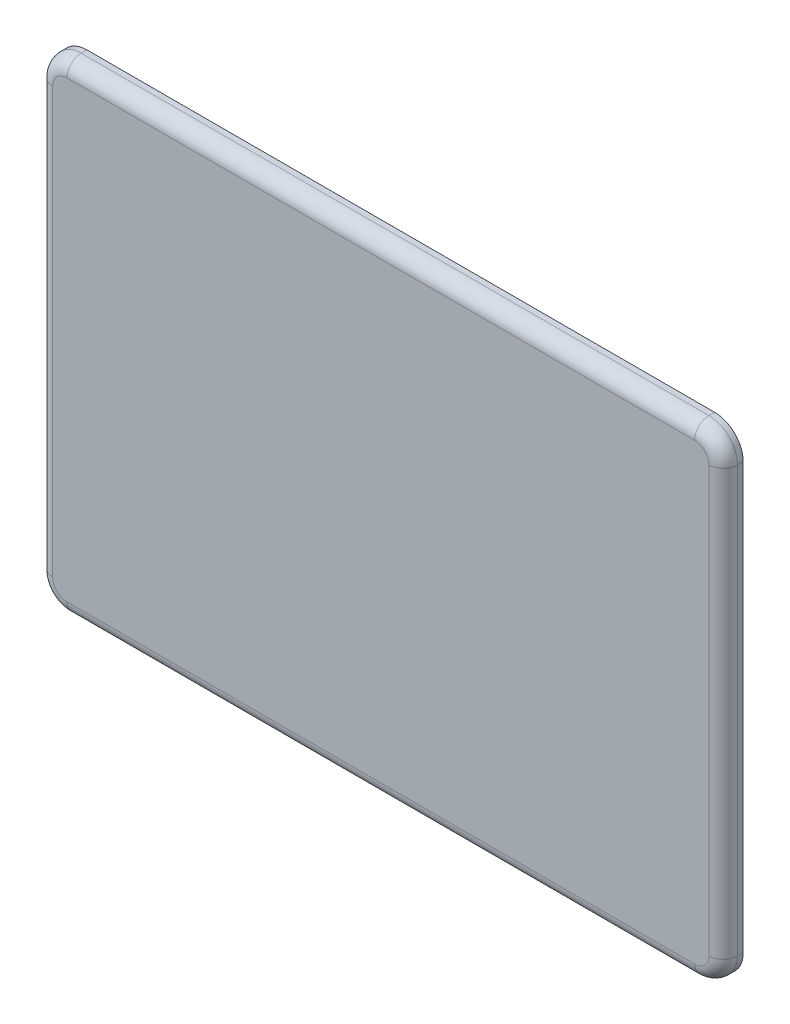
ISO-10303-21;
HEADER;
FILE_DESCRIPTION(('STEP AP214'),'2;1');
FILE_NAME('part.step','',(''),(''),'','','');
FILE_SCHEMA(('AUTOMOTIVE_DESIGN { 1 0 10303 214 1 1 1 1 }'));
ENDSEC;
DATA;
#1=APPLICATION_CONTEXT('core data for automotive mechanical design processes');
#2=APPLICATION_PROTOCOL_DEFINITION('international standard','automotive_design',2000,#1);
#3=PRODUCT_CONTEXT('',#1,'mechanical');
#4=PRODUCT('Part','Part','',(#3));
#5=PRODUCT_RELATED_PRODUCT_CATEGORY('part','',(#4));
#6=PRODUCT_DEFINITION_FORMATION('','',#4);
#7=PRODUCT_DEFINITION_CONTEXT('part definition',#1,'design');
#8=PRODUCT_DEFINITION('design','',#6,#7);
#9=PRODUCT_DEFINITION_SHAPE('','',#8);
#10=(LENGTH_UNIT() NAMED_UNIT(*) SI_UNIT(.MILLI.,.METRE.));
#11=(NAMED_UNIT(*) PLANE_ANGLE_UNIT() SI_UNIT($,.RADIAN.));
#12=(NAMED_UNIT(*) SI_UNIT($,.STERADIAN.) SOLID_ANGLE_UNIT());
#13=UNCERTAINTY_MEASURE_WITH_UNIT(LENGTH_MEASURE(1.E-05),#10,'distance_accuracy_value','');
#14=(GEOMETRIC_REPRESENTATION_CONTEXT(3) GLOBAL_UNCERTAINTY_ASSIGNED_CONTEXT((#13)) GLOBAL_UNIT_ASSIGNED_CONTEXT((#10,
#11,#12)) REPRESENTATION_CONTEXT('',''));
#15=CARTESIAN_POINT('',(0.,0.,0.));
#16=DIRECTION('',(0.,0.,1.));
#17=DIRECTION('',(1.,0.,0.));
#18=AXIS2_PLACEMENT_3D('',#15,#16,#17);
#19=CARTESIAN_POINT('',(-176.117936117936,75.0737100737101,7.));
#20=DIRECTION('',(0.,0.,-1.));
#21=DIRECTION('',(-1.,0.,0.));
#22=AXIS2_PLACEMENT_3D('',#19,#20,#21);
#23=CYLINDRICAL_SURFACE('',#22,10.);
#24=DIRECTION('',(0.,0.,-1.));
#25=VECTOR('',#24,1.);
#26=CARTESIAN_POINT('',(-186.117936117936,75.07371007371,7.));
#27=LINE('',#26,#25);
#28=CARTESIAN_POINT('',(-186.117936117936,75.07371007371,2.));
#29=VERTEX_POINT('',#28);
#30=CARTESIAN_POINT('',(-186.117936117936,75.07371007371,0.));
#31=VERTEX_POINT('',#30);
#32=EDGE_CURVE('E263',#29,#31,#27,.T.);
#33=ORIENTED_EDGE('',*,*,#32,.F.);
#34=CARTESIAN_POINT('',(-176.117936117936,75.0737100737101,2.));
#35=DIRECTION('',(0.,0.,1.));
#36=DIRECTION('',(1.,0.,0.));
#37=AXIS2_PLACEMENT_3D('',#34,#35,#36);
#38=CIRCLE('',#37,10.);
#39=CARTESIAN_POINT('',(-176.117936117936,85.07371007371,2.));
#40=VERTEX_POINT('',#39);
#41=EDGE_CURVE('E291',#29,#40,#38,.F.);
#42=ORIENTED_EDGE('',*,*,#41,.T.);
#43=DIRECTION('',(0.,0.,-1.));
#44=VECTOR('',#43,1.);
#45=CARTESIAN_POINT('',(-176.117936117936,85.07371007371,7.));
#46=LINE('',#45,#44);
#47=CARTESIAN_POINT('',(-176.117936117936,85.07371007371,0.));
#48=VERTEX_POINT('',#47);
#49=EDGE_CURVE('E242',#40,#48,#46,.T.);
#50=ORIENTED_EDGE('',*,*,#49,.T.);
#51=CARTESIAN_POINT('',(-176.117936117936,75.0737100737101,0.));
#52=DIRECTION('',(0.,0.,1.));
#53=DIRECTION('',(1.,0.,0.));
#54=AXIS2_PLACEMENT_3D('',#51,#52,#53);
#55=CIRCLE('',#54,10.);
#56=EDGE_CURVE('E210',#48,#31,#55,.T.);
#57=ORIENTED_EDGE('',*,*,#56,.T.);
#58=EDGE_LOOP('',(#33,#42,#50,#57));
#59=FACE_BOUND('',#58,.T.);
#60=ADVANCED_FACE('F40',(#59),#23,.T.);
#61=CARTESIAN_POINT('',(-186.117936117936,75.07371007371,7.));
#62=DIRECTION('',(1.,0.,0.));
#63=DIRECTION('',(0.,0.,-1.));
#64=AXIS2_PLACEMENT_3D('',#61,#62,#63);
#65=PLANE('',#64);
#66=DIRECTION('',(0.,0.,-1.));
#67=VECTOR('',#66,1.);
#68=CARTESIAN_POINT('',(-186.117936117936,-73.9262899262899,7.));
#69=LINE('',#68,#67);
#70=CARTESIAN_POINT('',(-186.117936117936,-73.9262899262899,2.));
#71=VERTEX_POINT('',#70);
#72=CARTESIAN_POINT('',(-186.117936117936,-73.9262899262899,0.));
#73=VERTEX_POINT('',#72);
#74=EDGE_CURVE('E260',#71,#73,#69,.T.);
#75=ORIENTED_EDGE('',*,*,#74,.F.);
#76=DIRECTION('',(0.,-1.,0.));
#77=VECTOR('',#76,1.);
#78=CARTESIAN_POINT('',(-186.117936117936,75.07371007371,2.));
#79=LINE('',#78,#77);
#80=EDGE_CURVE('E11',#71,#29,#79,.F.);
#81=ORIENTED_EDGE('',*,*,#80,.T.);
#82=ORIENTED_EDGE('',*,*,#32,.T.);
#83=DIRECTION('',(0.,-1.,0.));
#84=VECTOR('',#83,1.);
#85=CARTESIAN_POINT('',(-186.117936117936,75.07371007371,0.));
#86=LINE('',#85,#84);
#87=EDGE_CURVE('E214',#31,#73,#86,.T.);
#88=ORIENTED_EDGE('',*,*,#87,.T.);
#89=EDGE_LOOP('',(#75,#81,#82,#88));
#90=FACE_BOUND('',#89,.T.);
#91=ADVANCED_FACE('F393',(#90),#65,.F.);
#92=CARTESIAN_POINT('',(-176.117936117936,-73.92628992629,7.));
#93=DIRECTION('',(0.,0.,-1.));
#94=DIRECTION('',(-1.,0.,0.));
#95=AXIS2_PLACEMENT_3D('',#92,#93,#94);
#96=CYLINDRICAL_SURFACE('',#95,10.);
#97=DIRECTION('',(0.,0.,-1.));
#98=VECTOR('',#97,1.);
#99=CARTESIAN_POINT('',(-176.117936117936,-83.92628992629,7.));
#100=LINE('',#99,#98);
#101=CARTESIAN_POINT('',(-176.117936117936,-83.92628992629,2.));
#102=VERTEX_POINT('',#101);
#103=CARTESIAN_POINT('',(-176.117936117936,-83.92628992629,0.));
#104=VERTEX_POINT('',#103);
#105=EDGE_CURVE('E257',#102,#104,#100,.T.);
#106=ORIENTED_EDGE('',*,*,#105,.F.);
#107=CARTESIAN_POINT('',(-176.117936117936,-73.92628992629,2.));
#108=DIRECTION('',(0.,0.,1.));
#109=DIRECTION('',(1.,0.,0.));
#110=AXIS2_PLACEMENT_3D('',#107,#108,#109);
#111=CIRCLE('',#110,10.);
#112=EDGE_CURVE('E50',#102,#71,#111,.F.);
#113=ORIENTED_EDGE('',*,*,#112,.T.);
#114=ORIENTED_EDGE('',*,*,#74,.T.);
#115=CARTESIAN_POINT('',(-176.117936117936,-73.92628992629,0.));
#116=DIRECTION('',(0.,0.,1.));
#117=DIRECTION('',(1.,0.,0.));
#118=AXIS2_PLACEMENT_3D('',#115,#116,#117);
#119=CIRCLE('',#118,10.);
#120=EDGE_CURVE('E218',#73,#104,#119,.T.);
#121=ORIENTED_EDGE('',*,*,#120,.T.);
#122=EDGE_LOOP('',(#106,#113,#114,#121));
#123=FACE_BOUND('',#122,.T.);
#124=ADVANCED_FACE('F412',(#123),#96,.T.);
#125=CARTESIAN_POINT('',(-176.117936117936,-83.92628992629,7.));
#126=DIRECTION('',(0.,1.,0.));
#127=DIRECTION('',(0.,0.,1.));
#128=AXIS2_PLACEMENT_3D('',#125,#126,#127);
#129=PLANE('',#128);
#130=DIRECTION('',(0.,0.,-1.));
#131=VECTOR('',#130,1.);
#132=CARTESIAN_POINT('',(43.8820638820638,-83.92628992629,7.));
#133=LINE('',#132,#131);
#134=CARTESIAN_POINT('',(43.8820638820638,-83.92628992629,2.));
#135=VERTEX_POINT('',#134);
#136=CARTESIAN_POINT('',(43.8820638820638,-83.92628992629,0.));
#137=VERTEX_POINT('',#136);
#138=EDGE_CURVE('E254',#135,#137,#133,.T.);
#139=ORIENTED_EDGE('',*,*,#138,.F.);
#140=DIRECTION('',(1.,0.,0.));
#141=VECTOR('',#140,1.);
#142=CARTESIAN_POINT('',(-176.117936117936,-83.92628992629,2.));
#143=LINE('',#142,#141);
#144=EDGE_CURVE('E65',#135,#102,#143,.F.);
#145=ORIENTED_EDGE('',*,*,#144,.T.);
#146=ORIENTED_EDGE('',*,*,#105,.T.);
#147=DIRECTION('',(1.,0.,0.));
#148=VECTOR('',#147,1.);
#149=CARTESIAN_POINT('',(-176.117936117936,-83.92628992629,0.));
#150=LINE('',#149,#148);
#151=EDGE_CURVE('E222',#104,#137,#150,.T.);
#152=ORIENTED_EDGE('',*,*,#151,.T.);
#153=EDGE_LOOP('',(#139,#145,#146,#152));
#154=FACE_BOUND('',#153,.T.);
#155=ADVANCED_FACE('F351',(#154),#129,.F.);
#156=CARTESIAN_POINT('',(43.8820638820639,-73.92628992629,7.));
#157=DIRECTION('',(0.,0.,-1.));
#158=DIRECTION('',(-1.,0.,0.));
#159=AXIS2_PLACEMENT_3D('',#156,#157,#158);
#160=CYLINDRICAL_SURFACE('',#159,10.);
#161=DIRECTION('',(0.,0.,-1.));
#162=VECTOR('',#161,1.);
#163=CARTESIAN_POINT('',(53.8820638820639,-73.9262899262899,7.));
#164=LINE('',#163,#162);
#165=CARTESIAN_POINT('',(53.8820638820639,-73.9262899262899,2.));
#166=VERTEX_POINT('',#165);
#167=CARTESIAN_POINT('',(53.8820638820639,-73.9262899262899,0.));
#168=VERTEX_POINT('',#167);
#169=EDGE_CURVE('E251',#166,#168,#164,.T.);
#170=ORIENTED_EDGE('',*,*,#169,.F.);
#171=CARTESIAN_POINT('',(43.8820638820639,-73.92628992629,2.));
#172=DIRECTION('',(0.,0.,1.));
#173=DIRECTION('',(1.,0.,0.));
#174=AXIS2_PLACEMENT_3D('',#171,#172,#173);
#175=CIRCLE('',#174,10.);
#176=EDGE_CURVE('E304',#166,#135,#175,.F.);
#177=ORIENTED_EDGE('',*,*,#176,.T.);
#178=ORIENTED_EDGE('',*,*,#138,.T.);
#179=CARTESIAN_POINT('',(43.8820638820639,-73.92628992629,0.));
#180=DIRECTION('',(0.,0.,1.));
#181=DIRECTION('',(1.,0.,0.));
#182=AXIS2_PLACEMENT_3D('',#179,#180,#181);
#183=CIRCLE('',#182,10.);
#184=EDGE_CURVE('E226',#137,#168,#183,.T.);
#185=ORIENTED_EDGE('',*,*,#184,.T.);
#186=EDGE_LOOP('',(#170,#177,#178,#185));
#187=FACE_BOUND('',#186,.T.);
#188=ADVANCED_FACE('F350',(#187),#160,.T.);
#189=CARTESIAN_POINT('',(53.8820638820639,75.07371007371,7.));
#190=DIRECTION('',(-1.,0.,0.));
#191=DIRECTION('',(0.,-1.,0.));
#192=AXIS2_PLACEMENT_3D('',#189,#190,#191);
#193=PLANE('',#192);
#194=DIRECTION('',(0.,0.,-1.));
#195=VECTOR('',#194,1.);
#196=CARTESIAN_POINT('',(53.8820638820639,75.07371007371,7.));
#197=LINE('',#196,#195);
#198=CARTESIAN_POINT('',(53.8820638820639,75.07371007371,2.));
#199=VERTEX_POINT('',#198);
#200=CARTESIAN_POINT('',(53.8820638820639,75.07371007371,0.));
#201=VERTEX_POINT('',#200);
#202=EDGE_CURVE('E248',#199,#201,#197,.T.);
#203=ORIENTED_EDGE('',*,*,#202,.F.);
#204=DIRECTION('',(0.,1.,0.));
#205=VECTOR('',#204,1.);
#206=CARTESIAN_POINT('',(53.8820638820639,-73.9262899262899,2.));
#207=LINE('',#206,#205);
#208=EDGE_CURVE('E301',#199,#166,#207,.F.);
#209=ORIENTED_EDGE('',*,*,#208,.T.);
#210=ORIENTED_EDGE('',*,*,#169,.T.);
#211=DIRECTION('',(0.,1.,0.));
#212=VECTOR('',#211,1.);
#213=CARTESIAN_POINT('',(53.8820638820639,75.07371007371,0.));
#214=LINE('',#213,#212);
#215=EDGE_CURVE('E230',#168,#201,#214,.T.);
#216=ORIENTED_EDGE('',*,*,#215,.T.);
#217=EDGE_LOOP('',(#203,#209,#210,#216));
#218=FACE_BOUND('',#217,.T.);
#219=ADVANCED_FACE('F363',(#218),#193,.F.);
#220=CARTESIAN_POINT('',(43.8820638820639,75.0737100737101,7.));
#221=DIRECTION('',(0.,0.,-1.));
#222=DIRECTION('',(-1.,0.,0.));
#223=AXIS2_PLACEMENT_3D('',#220,#221,#222);
#224=CYLINDRICAL_SURFACE('',#223,9.99999999999999);
#225=DIRECTION('',(0.,0.,-1.));
#226=VECTOR('',#225,1.);
#227=CARTESIAN_POINT('',(43.8820638820638,85.07371007371,7.));
#228=LINE('',#227,#226);
#229=CARTESIAN_POINT('',(43.8820638820638,85.07371007371,2.));
#230=VERTEX_POINT('',#229);
#231=CARTESIAN_POINT('',(43.8820638820638,85.07371007371,0.));
#232=VERTEX_POINT('',#231);
#233=EDGE_CURVE('E245',#230,#232,#228,.T.);
#234=ORIENTED_EDGE('',*,*,#233,.F.);
#235=CARTESIAN_POINT('',(43.8820638820639,75.0737100737101,2.));
#236=DIRECTION('',(0.,0.,1.));
#237=DIRECTION('',(1.,0.,0.));
#238=AXIS2_PLACEMENT_3D('',#235,#236,#237);
#239=CIRCLE('',#238,9.99999999999999);
#240=EDGE_CURVE('E298',#230,#199,#239,.F.);
#241=ORIENTED_EDGE('',*,*,#240,.T.);
#242=ORIENTED_EDGE('',*,*,#202,.T.);
#243=CARTESIAN_POINT('',(43.8820638820639,75.0737100737101,0.));
#244=DIRECTION('',(0.,0.,1.));
#245=DIRECTION('',(-1.,0.,0.));
#246=AXIS2_PLACEMENT_3D('',#243,#244,#245);
#247=CIRCLE('',#246,9.99999999999999);
#248=EDGE_CURVE('E234',#201,#232,#247,.T.);
#249=ORIENTED_EDGE('',*,*,#248,.T.);
#250=EDGE_LOOP('',(#234,#241,#242,#249));
#251=FACE_BOUND('',#250,.T.);
#252=ADVANCED_FACE('F366',(#251),#224,.T.);
#253=CARTESIAN_POINT('',(-176.117936117936,85.07371007371,7.));
#254=DIRECTION('',(0.,-1.,0.));
#255=DIRECTION('',(0.,0.,-1.));
#256=AXIS2_PLACEMENT_3D('',#253,#254,#255);
#257=PLANE('',#256);
#258=ORIENTED_EDGE('',*,*,#49,.F.);
#259=DIRECTION('',(-1.,0.,0.));
#260=VECTOR('',#259,1.);
#261=CARTESIAN_POINT('',(43.8820638820638,85.07371007371,2.));
#262=LINE('',#261,#260);
#263=EDGE_CURVE('E295',#40,#230,#262,.F.);
#264=ORIENTED_EDGE('',*,*,#263,.T.);
#265=ORIENTED_EDGE('',*,*,#233,.T.);
#266=DIRECTION('',(-1.,0.,0.));
#267=VECTOR('',#266,1.);
#268=CARTESIAN_POINT('',(-176.117936117936,85.07371007371,0.));
#269=LINE('',#268,#267);
#270=EDGE_CURVE('E238',#232,#48,#269,.T.);
#271=ORIENTED_EDGE('',*,*,#270,.T.);
#272=EDGE_LOOP('',(#258,#264,#265,#271));
#273=FACE_BOUND('',#272,.T.);
#274=ADVANCED_FACE('F425',(#273),#257,.F.);
#275=CARTESIAN_POINT('',(-176.117936117936,75.0737100737101,7.));
#276=DIRECTION('',(0.,0.,1.));
#277=DIRECTION('',(1.,0.,0.));
#278=AXIS2_PLACEMENT_3D('',#275,#276,#277);
#279=PLANE('',#278);
#280=DIRECTION('',(-1.,0.,0.));
#281=VECTOR('',#280,1.);
#282=CARTESIAN_POINT('',(-176.117936117936,80.07371007371,7.));
#283=LINE('',#282,#281);
#284=CARTESIAN_POINT('',(43.8820638820638,80.07371007371,7.));
#285=VERTEX_POINT('',#284);
#286=CARTESIAN_POINT('',(-176.117936117936,80.07371007371,7.));
#287=VERTEX_POINT('',#286);
#288=EDGE_CURVE('E284',#285,#287,#283,.T.);
#289=ORIENTED_EDGE('',*,*,#288,.T.);
#290=CARTESIAN_POINT('',(-176.117936117936,75.0737100737101,7.));
#291=DIRECTION('',(0.,0.,1.));
#292=DIRECTION('',(1.,0.,0.));
#293=AXIS2_PLACEMENT_3D('',#290,#291,#292);
#294=CIRCLE('',#293,5.);
#295=CARTESIAN_POINT('',(-181.117936117936,75.07371007371,7.));
#296=VERTEX_POINT('',#295);
#297=EDGE_CURVE('E287',#287,#296,#294,.T.);
#298=ORIENTED_EDGE('',*,*,#297,.T.);
#299=DIRECTION('',(0.,-1.,0.));
#300=VECTOR('',#299,1.);
#301=CARTESIAN_POINT('',(-181.117936117936,-73.9262899262899,7.));
#302=LINE('',#301,#300);
#303=CARTESIAN_POINT('',(-181.117936117936,-73.9262899262899,7.));
#304=VERTEX_POINT('',#303);
#305=EDGE_CURVE('E266',#296,#304,#302,.T.);
#306=ORIENTED_EDGE('',*,*,#305,.T.);
#307=CARTESIAN_POINT('',(-176.117936117936,-73.92628992629,7.));
#308=DIRECTION('',(0.,0.,1.));
#309=DIRECTION('',(1.,0.,0.));
#310=AXIS2_PLACEMENT_3D('',#307,#308,#309);
#311=CIRCLE('',#310,5.);
#312=CARTESIAN_POINT('',(-176.117936117936,-78.92628992629,7.));
#313=VERTEX_POINT('',#312);
#314=EDGE_CURVE('E269',#304,#313,#311,.T.);
#315=ORIENTED_EDGE('',*,*,#314,.T.);
#316=DIRECTION('',(1.,0.,0.));
#317=VECTOR('',#316,1.);
#318=CARTESIAN_POINT('',(43.8820638820638,-78.92628992629,7.));
#319=LINE('',#318,#317);
#320=CARTESIAN_POINT('',(43.8820638820639,-78.92628992629,7.));
#321=VERTEX_POINT('',#320);
#322=EDGE_CURVE('E272',#313,#321,#319,.T.);
#323=ORIENTED_EDGE('',*,*,#322,.T.);
#324=CARTESIAN_POINT('',(43.8820638820639,-73.92628992629,7.));
#325=DIRECTION('',(0.,0.,1.));
#326=DIRECTION('',(1.,0.,0.));
#327=AXIS2_PLACEMENT_3D('',#324,#325,#326);
#328=CIRCLE('',#327,5.);
#329=CARTESIAN_POINT('',(48.8820638820639,-73.9262899262899,7.));
#330=VERTEX_POINT('',#329);
#331=EDGE_CURVE('E275',#321,#330,#328,.T.);
#332=ORIENTED_EDGE('',*,*,#331,.T.);
#333=DIRECTION('',(0.,1.,0.));
#334=VECTOR('',#333,1.);
#335=CARTESIAN_POINT('',(48.8820638820639,75.07371007371,7.));
#336=LINE('',#335,#334);
#337=CARTESIAN_POINT('',(48.8820638820639,75.07371007371,7.));
#338=VERTEX_POINT('',#337);
#339=EDGE_CURVE('E278',#330,#338,#336,.T.);
#340=ORIENTED_EDGE('',*,*,#339,.T.);
#341=CARTESIAN_POINT('',(43.8820638820639,75.0737100737101,7.));
#342=DIRECTION('',(0.,0.,1.));
#343=DIRECTION('',(1.,0.,0.));
#344=AXIS2_PLACEMENT_3D('',#341,#342,#343);
#345=CIRCLE('',#344,4.99999999999999);
#346=EDGE_CURVE('E281',#338,#285,#345,.T.);
#347=ORIENTED_EDGE('',*,*,#346,.T.);
#348=EDGE_LOOP('',(#289,#298,#306,#315,#323,#332,#340,#347));
#349=FACE_BOUND('',#348,.T.);
#350=ADVANCED_FACE('F379',(#349),#279,.T.);
#351=CARTESIAN_POINT('',(-176.117936117936,75.0737100737101,0.));
#352=DIRECTION('',(0.,0.,1.));
#353=DIRECTION('',(1.,0.,0.));
#354=AXIS2_PLACEMENT_3D('',#351,#352,#353);
#355=PLANE('',#354);
#356=ORIENTED_EDGE('',*,*,#56,.F.);
#357=ORIENTED_EDGE('',*,*,#270,.F.);
#358=ORIENTED_EDGE('',*,*,#248,.F.);
#359=ORIENTED_EDGE('',*,*,#215,.F.);
#360=ORIENTED_EDGE('',*,*,#184,.F.);
#361=ORIENTED_EDGE('',*,*,#151,.F.);
#362=ORIENTED_EDGE('',*,*,#120,.F.);
#363=ORIENTED_EDGE('',*,*,#87,.F.);
#364=EDGE_LOOP('',(#356,#357,#358,#359,#360,#361,#362,#363));
#365=FACE_BOUND('',#364,.T.);
#366=ADVANCED_FACE('F358',(#365),#355,.F.);
#367=CARTESIAN_POINT('',(43.8820638820639,-73.92628992629,2.));
#368=DIRECTION('',(0.,0.,1.));
#369=DIRECTION('',(1.,0.,0.));
#370=AXIS2_PLACEMENT_3D('',#367,#368,#369);
#371=DEGENERATE_TOROIDAL_SURFACE('',#370,5.,5.,.T.);
#372=CARTESIAN_POINT('',(43.8820638820639,-78.92628992629,2.));
#373=DIRECTION('',(-1.,0.,0.));
#374=DIRECTION('',(0.,-1.,0.));
#375=AXIS2_PLACEMENT_3D('',#372,#373,#374);
#376=CIRCLE('',#375,5.);
#377=EDGE_CURVE('E331',#135,#321,#376,.T.);
#378=ORIENTED_EDGE('',*,*,#377,.F.);
#379=ORIENTED_EDGE('',*,*,#176,.F.);
#380=CARTESIAN_POINT('',(48.8820638820639,-73.9262899262899,2.));
#381=DIRECTION('',(0.,1.,0.));
#382=DIRECTION('',(0.,0.,1.));
#383=AXIS2_PLACEMENT_3D('',#380,#381,#382);
#384=CIRCLE('',#383,5.);
#385=EDGE_CURVE('E44',#330,#166,#384,.T.);
#386=ORIENTED_EDGE('',*,*,#385,.F.);
#387=ORIENTED_EDGE('',*,*,#331,.F.);
#388=EDGE_LOOP('',(#378,#379,#386,#387));
#389=FACE_BOUND('',#388,.T.);
#390=ADVANCED_FACE('F42',(#389),#371,.T.);
#391=CARTESIAN_POINT('',(48.8820638820639,75.0737100737101,2.));
#392=DIRECTION('',(0.,-1.,0.));
#393=DIRECTION('',(1.,0.,0.));
#394=AXIS2_PLACEMENT_3D('',#391,#392,#393);
#395=CYLINDRICAL_SURFACE('',#394,5.);
#396=ORIENTED_EDGE('',*,*,#385,.T.);
#397=ORIENTED_EDGE('',*,*,#208,.F.);
#398=CARTESIAN_POINT('',(48.8820638820639,75.07371007371,2.));
#399=DIRECTION('',(0.,1.,0.));
#400=DIRECTION('',(-1.,0.,0.));
#401=AXIS2_PLACEMENT_3D('',#398,#399,#400);
#402=CIRCLE('',#401,5.);
#403=EDGE_CURVE('E328',#338,#199,#402,.T.);
#404=ORIENTED_EDGE('',*,*,#403,.F.);
#405=ORIENTED_EDGE('',*,*,#339,.F.);
#406=EDGE_LOOP('',(#396,#397,#404,#405));
#407=FACE_BOUND('',#406,.T.);
#408=ADVANCED_FACE('F343',(#407),#395,.T.);
#409=CARTESIAN_POINT('',(-176.117936117936,-78.92628992629,2.));
#410=DIRECTION('',(-1.,0.,0.));
#411=DIRECTION('',(0.,0.,1.));
#412=AXIS2_PLACEMENT_3D('',#409,#410,#411);
#413=CYLINDRICAL_SURFACE('',#412,5.);
#414=ORIENTED_EDGE('',*,*,#377,.T.);
#415=ORIENTED_EDGE('',*,*,#322,.F.);
#416=CARTESIAN_POINT('',(-176.117936117936,-78.92628992629,2.));
#417=DIRECTION('',(-1.,0.,0.));
#418=DIRECTION('',(0.,0.,1.));
#419=AXIS2_PLACEMENT_3D('',#416,#417,#418);
#420=CIRCLE('',#419,5.);
#421=EDGE_CURVE('E324',#102,#313,#420,.T.);
#422=ORIENTED_EDGE('',*,*,#421,.F.);
#423=ORIENTED_EDGE('',*,*,#144,.F.);
#424=EDGE_LOOP('',(#414,#415,#422,#423));
#425=FACE_BOUND('',#424,.T.);
#426=ADVANCED_FACE('F382',(#425),#413,.T.);
#427=CARTESIAN_POINT('',(43.8820638820639,75.0737100737101,2.));
#428=DIRECTION('',(0.,0.,1.));
#429=DIRECTION('',(1.,0.,0.));
#430=AXIS2_PLACEMENT_3D('',#427,#428,#429);
#431=DEGENERATE_TOROIDAL_SURFACE('',#430,4.99999999999999,5.,.T.);
#432=ORIENTED_EDGE('',*,*,#403,.T.);
#433=ORIENTED_EDGE('',*,*,#240,.F.);
#434=CARTESIAN_POINT('',(43.8820638820638,80.07371007371,2.));
#435=DIRECTION('',(-1.,0.,0.));
#436=DIRECTION('',(0.,0.,1.));
#437=AXIS2_PLACEMENT_3D('',#434,#435,#436);
#438=CIRCLE('',#437,5.);
#439=EDGE_CURVE('E320',#285,#230,#438,.T.);
#440=ORIENTED_EDGE('',*,*,#439,.F.);
#441=ORIENTED_EDGE('',*,*,#346,.F.);
#442=EDGE_LOOP('',(#432,#433,#440,#441));
#443=FACE_BOUND('',#442,.T.);
#444=ADVANCED_FACE('F370',(#443),#431,.T.);
#445=CARTESIAN_POINT('',(-176.117936117936,-73.92628992629,2.));
#446=DIRECTION('',(0.,0.,1.));
#447=DIRECTION('',(1.,0.,0.));
#448=AXIS2_PLACEMENT_3D('',#445,#446,#447);
#449=TOROIDAL_SURFACE('',#448,5.,5.);
#450=ORIENTED_EDGE('',*,*,#421,.T.);
#451=ORIENTED_EDGE('',*,*,#314,.F.);
#452=CARTESIAN_POINT('',(-181.117936117936,-73.9262899262899,2.));
#453=DIRECTION('',(0.,1.,0.));
#454=DIRECTION('',(-1.,0.,0.));
#455=AXIS2_PLACEMENT_3D('',#452,#453,#454);
#456=CIRCLE('',#455,5.);
#457=EDGE_CURVE('E316',#71,#304,#456,.T.);
#458=ORIENTED_EDGE('',*,*,#457,.F.);
#459=ORIENTED_EDGE('',*,*,#112,.F.);
#460=EDGE_LOOP('',(#450,#451,#458,#459));
#461=FACE_BOUND('',#460,.T.);
#462=ADVANCED_FACE('F384',(#461),#449,.T.);
#463=CARTESIAN_POINT('',(-176.117936117936,80.07371007371,2.));
#464=DIRECTION('',(1.,0.,0.));
#465=DIRECTION('',(0.,0.,-1.));
#466=AXIS2_PLACEMENT_3D('',#463,#464,#465);
#467=CYLINDRICAL_SURFACE('',#466,5.);
#468=ORIENTED_EDGE('',*,*,#439,.T.);
#469=ORIENTED_EDGE('',*,*,#263,.F.);
#470=CARTESIAN_POINT('',(-176.117936117936,80.07371007371,2.));
#471=DIRECTION('',(-1.,0.,0.));
#472=DIRECTION('',(0.,-1.,0.));
#473=AXIS2_PLACEMENT_3D('',#470,#471,#472);
#474=CIRCLE('',#473,5.);
#475=EDGE_CURVE('E313',#287,#40,#474,.T.);
#476=ORIENTED_EDGE('',*,*,#475,.F.);
#477=ORIENTED_EDGE('',*,*,#288,.F.);
#478=EDGE_LOOP('',(#468,#469,#476,#477));
#479=FACE_BOUND('',#478,.T.);
#480=ADVANCED_FACE('F375',(#479),#467,.T.);
#481=CARTESIAN_POINT('',(-181.117936117936,75.0737100737101,2.));
#482=DIRECTION('',(0.,1.,0.));
#483=DIRECTION('',(0.,0.,1.));
#484=AXIS2_PLACEMENT_3D('',#481,#482,#483);
#485=CYLINDRICAL_SURFACE('',#484,5.);
#486=ORIENTED_EDGE('',*,*,#457,.T.);
#487=ORIENTED_EDGE('',*,*,#305,.F.);
#488=CARTESIAN_POINT('',(-181.117936117936,75.07371007371,2.));
#489=DIRECTION('',(0.,1.,0.));
#490=DIRECTION('',(0.,0.,1.));
#491=AXIS2_PLACEMENT_3D('',#488,#489,#490);
#492=CIRCLE('',#491,5.);
#493=EDGE_CURVE('E204',#29,#296,#492,.T.);
#494=ORIENTED_EDGE('',*,*,#493,.F.);
#495=ORIENTED_EDGE('',*,*,#80,.F.);
#496=EDGE_LOOP('',(#486,#487,#494,#495));
#497=FACE_BOUND('',#496,.T.);
#498=ADVANCED_FACE('F390',(#497),#485,.T.);
#499=CARTESIAN_POINT('',(-176.117936117936,75.0737100737101,2.));
#500=DIRECTION('',(0.,0.,1.));
#501=DIRECTION('',(1.,0.,0.));
#502=AXIS2_PLACEMENT_3D('',#499,#500,#501);
#503=TOROIDAL_SURFACE('',#502,5.,5.);
#504=ORIENTED_EDGE('',*,*,#475,.T.);
#505=ORIENTED_EDGE('',*,*,#41,.F.);
#506=ORIENTED_EDGE('',*,*,#493,.T.);
#507=ORIENTED_EDGE('',*,*,#297,.F.);
#508=EDGE_LOOP('',(#504,#505,#506,#507));
#509=FACE_BOUND('',#508,.T.);
#510=ADVANCED_FACE('F399',(#509),#503,.T.);
#511=CLOSED_SHELL('',(#60,#91,#124,#155,#188,#219,#252,#274,#350,#366,#390,#408,#426,#444,#462,
#480,#498,#510));
#512=CARTESIAN_POINT('',(14.6560503251578,46.5359032244947,1.5));
#513=DIRECTION('',(1.,0.,0.));
#514=DIRECTION('',(0.,0.,-1.));
#515=AXIS2_PLACEMENT_3D('',#512,#513,#514);
#516=PLANE('',#515);
#517=DIRECTION('',(0.,1.,0.));
#518=VECTOR('',#517,1.);
#519=CARTESIAN_POINT('',(14.6560503251578,46.5359032244947,5.5));
#520=LINE('',#519,#518);
#521=CARTESIAN_POINT('',(14.6560503251578,-60.32232428403,5.5));
#522=VERTEX_POINT('',#521);
#523=CARTESIAN_POINT('',(14.6560503251578,46.5359032244947,5.5));
#524=VERTEX_POINT('',#523);
#525=EDGE_CURVE('E162',#522,#524,#520,.T.);
#526=ORIENTED_EDGE('',*,*,#525,.T.);
#527=DIRECTION('',(0.,0.,1.));
#528=VECTOR('',#527,1.);
#529=CARTESIAN_POINT('',(14.6560503251578,46.5359032244947,1.5));
#530=LINE('',#529,#528);
#531=CARTESIAN_POINT('',(14.6560503251578,46.5359032244947,1.5));
#532=VERTEX_POINT('',#531);
#533=EDGE_CURVE('E155',#532,#524,#530,.T.);
#534=ORIENTED_EDGE('',*,*,#533,.F.);
#535=DIRECTION('',(0.,1.,0.));
#536=VECTOR('',#535,1.);
#537=CARTESIAN_POINT('',(14.6560503251578,46.5359032244947,1.5));
#538=LINE('',#537,#536);
#539=CARTESIAN_POINT('',(14.6560503251578,-60.32232428403,1.5));
#540=VERTEX_POINT('',#539);
#541=EDGE_CURVE('E159',#540,#532,#538,.T.);
#542=ORIENTED_EDGE('',*,*,#541,.F.);
#543=DIRECTION('',(0.,0.,1.));
#544=VECTOR('',#543,1.);
#545=CARTESIAN_POINT('',(14.6560503251578,-60.32232428403,1.5));
#546=LINE('',#545,#544);
#547=EDGE_CURVE('E201',#540,#522,#546,.T.);
#548=ORIENTED_EDGE('',*,*,#547,.T.);
#549=EDGE_LOOP('',(#526,#534,#542,#548));
#550=FACE_BOUND('',#549,.T.);
#551=ADVANCED_FACE('F157',(#550),#516,.F.);
#552=CARTESIAN_POINT('',(14.6560503251578,-60.32232428403,1.5));
#553=DIRECTION('',(0.,-1.,0.));
#554=DIRECTION('',(1.,0.,0.));
#555=AXIS2_PLACEMENT_3D('',#552,#553,#554);
#556=PLANE('',#555);
#557=DIRECTION('',(1.,0.,0.));
#558=VECTOR('',#557,1.);
#559=CARTESIAN_POINT('',(14.6560503251578,-60.32232428403,5.5));
#560=LINE('',#559,#558);
#561=CARTESIAN_POINT('',(-155.628463423966,-60.3223242840301,5.5));
#562=VERTEX_POINT('',#561);
#563=EDGE_CURVE('E182',#562,#522,#560,.T.);
#564=ORIENTED_EDGE('',*,*,#563,.T.);
#565=ORIENTED_EDGE('',*,*,#547,.F.);
#566=DIRECTION('',(1.,0.,0.));
#567=VECTOR('',#566,1.);
#568=CARTESIAN_POINT('',(14.6560503251578,-60.32232428403,1.5));
#569=LINE('',#568,#567);
#570=CARTESIAN_POINT('',(-155.628463423966,-60.3223242840301,1.5));
#571=VERTEX_POINT('',#570);
#572=EDGE_CURVE('E168',#571,#540,#569,.T.);
#573=ORIENTED_EDGE('',*,*,#572,.F.);
#574=DIRECTION('',(0.,0.,1.));
#575=VECTOR('',#574,1.);
#576=CARTESIAN_POINT('',(-155.628463423966,-60.3223242840301,1.5));
#577=LINE('',#576,#575);
#578=EDGE_CURVE('E205',#571,#562,#577,.T.);
#579=ORIENTED_EDGE('',*,*,#578,.T.);
#580=EDGE_LOOP('',(#564,#565,#573,#579));
#581=FACE_BOUND('',#580,.T.);
#582=ADVANCED_FACE('F434',(#581),#556,.F.);
#583=CARTESIAN_POINT('',(-155.628463423966,46.5359032244947,1.5));
#584=DIRECTION('',(-1.,0.,0.));
#585=DIRECTION('',(0.,0.,1.));
#586=AXIS2_PLACEMENT_3D('',#583,#584,#585);
#587=PLANE('',#586);
#588=DIRECTION('',(0.,-1.,0.));
#589=VECTOR('',#588,1.);
#590=CARTESIAN_POINT('',(-155.628463423966,46.5359032244947,5.5));
#591=LINE('',#590,#589);
#592=CARTESIAN_POINT('',(-155.628463423966,46.5359032244947,5.5));
#593=VERTEX_POINT('',#592);
#594=EDGE_CURVE('E186',#593,#562,#591,.T.);
#595=ORIENTED_EDGE('',*,*,#594,.T.);
#596=ORIENTED_EDGE('',*,*,#578,.F.);
#597=DIRECTION('',(0.,-1.,0.));
#598=VECTOR('',#597,1.);
#599=CARTESIAN_POINT('',(-155.628463423966,46.5359032244947,1.5));
#600=LINE('',#599,#598);
#601=CARTESIAN_POINT('',(-155.628463423966,46.5359032244947,1.5));
#602=VERTEX_POINT('',#601);
#603=EDGE_CURVE('E177',#602,#571,#600,.T.);
#604=ORIENTED_EDGE('',*,*,#603,.F.);
#605=DIRECTION('',(0.,0.,1.));
#606=VECTOR('',#605,1.);
#607=CARTESIAN_POINT('',(-155.628463423966,46.5359032244947,1.5));
#608=LINE('',#607,#606);
#609=EDGE_CURVE('E167',#602,#593,#608,.T.);
#610=ORIENTED_EDGE('',*,*,#609,.T.);
#611=EDGE_LOOP('',(#595,#596,#604,#610));
#612=FACE_BOUND('',#611,.T.);
#613=ADVANCED_FACE('F438',(#612),#587,.F.);
#614=CARTESIAN_POINT('',(14.6560503251578,46.5359032244947,1.5));
#615=DIRECTION('',(0.,1.,0.));
#616=DIRECTION('',(0.,0.,1.));
#617=AXIS2_PLACEMENT_3D('',#614,#615,#616);
#618=PLANE('',#617);
#619=DIRECTION('',(-1.,0.,0.));
#620=VECTOR('',#619,1.);
#621=CARTESIAN_POINT('',(14.6560503251578,46.5359032244947,5.5));
#622=LINE('',#621,#620);
#623=EDGE_CURVE('E195',#524,#593,#622,.T.);
#624=ORIENTED_EDGE('',*,*,#623,.T.);
#625=ORIENTED_EDGE('',*,*,#609,.F.);
#626=DIRECTION('',(-1.,0.,0.));
#627=VECTOR('',#626,1.);
#628=CARTESIAN_POINT('',(14.6560503251578,46.5359032244947,1.5));
#629=LINE('',#628,#627);
#630=EDGE_CURVE('E171',#532,#602,#629,.T.);
#631=ORIENTED_EDGE('',*,*,#630,.F.);
#632=ORIENTED_EDGE('',*,*,#533,.T.);
#633=EDGE_LOOP('',(#624,#625,#631,#632));
#634=FACE_BOUND('',#633,.T.);
#635=ADVANCED_FACE('F172',(#634),#618,.F.);
#636=CARTESIAN_POINT('',(0.,0.,1.5));
#637=DIRECTION('',(0.,0.,-1.));
#638=DIRECTION('',(-1.,0.,0.));
#639=AXIS2_PLACEMENT_3D('',#636,#637,#638);
#640=PLANE('',#639);
#641=ORIENTED_EDGE('',*,*,#541,.T.);
#642=ORIENTED_EDGE('',*,*,#630,.T.);
#643=ORIENTED_EDGE('',*,*,#603,.T.);
#644=ORIENTED_EDGE('',*,*,#572,.T.);
#645=EDGE_LOOP('',(#641,#642,#643,#644));
#646=FACE_BOUND('',#645,.T.);
#647=ADVANCED_FACE('F179',(#646),#640,.F.);
#648=CARTESIAN_POINT('',(0.,0.,5.5));
#649=DIRECTION('',(0.,0.,-1.));
#650=DIRECTION('',(-1.,0.,0.));
#651=AXIS2_PLACEMENT_3D('',#648,#649,#650);
#652=PLANE('',#651);
#653=ORIENTED_EDGE('',*,*,#525,.F.);
#654=ORIENTED_EDGE('',*,*,#563,.F.);
#655=ORIENTED_EDGE('',*,*,#594,.F.);
#656=ORIENTED_EDGE('',*,*,#623,.F.);
#657=EDGE_LOOP('',(#653,#654,#655,#656));
#658=FACE_BOUND('',#657,.T.);
#659=ADVANCED_FACE('F445',(#658),#652,.T.);
#660=CLOSED_SHELL('',(#551,#582,#613,#635,#647,#659));
#661=ORIENTED_CLOSED_SHELL('',*,#660,.T.);
#662=BREP_WITH_VOIDS('B2',#511,(#661));
#663=ADVANCED_BREP_SHAPE_REPRESENTATION('',(#18,#662),#14);
#664=SHAPE_DEFINITION_REPRESENTATION(#9,#663);
ENDSEC;
END-ISO-10303-21;
